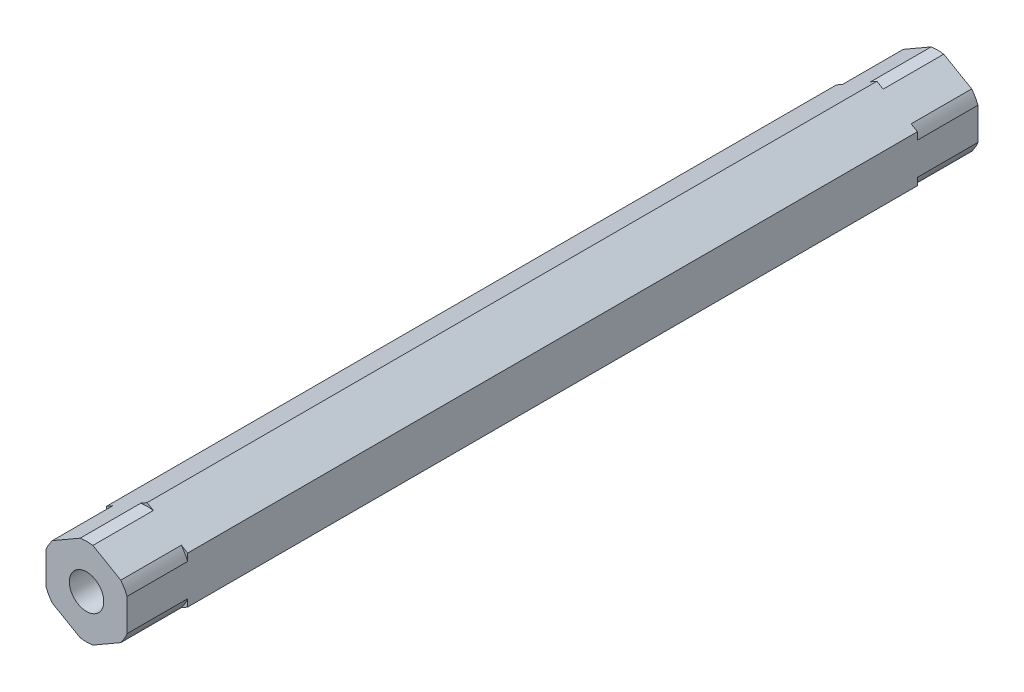
ISO-10303-21;
HEADER;
FILE_DESCRIPTION(('STEP AP214'),'2;1');
FILE_NAME('part.step','',(''),(''),'','','');
FILE_SCHEMA(('AUTOMOTIVE_DESIGN { 1 0 10303 214 1 1 1 1 }'));
ENDSEC;
DATA;
#1=APPLICATION_CONTEXT('core data for automotive mechanical design processes');
#2=APPLICATION_PROTOCOL_DEFINITION('international standard','automotive_design',2000,#1);
#3=PRODUCT_CONTEXT('',#1,'mechanical');
#4=PRODUCT('Part','Part','',(#3));
#5=PRODUCT_RELATED_PRODUCT_CATEGORY('part','',(#4));
#6=PRODUCT_DEFINITION_FORMATION('','',#4);
#7=PRODUCT_DEFINITION_CONTEXT('part definition',#1,'design');
#8=PRODUCT_DEFINITION('design','',#6,#7);
#9=PRODUCT_DEFINITION_SHAPE('','',#8);
#10=(LENGTH_UNIT() NAMED_UNIT(*) SI_UNIT(.MILLI.,.METRE.));
#11=(NAMED_UNIT(*) PLANE_ANGLE_UNIT() SI_UNIT($,.RADIAN.));
#12=(NAMED_UNIT(*) SI_UNIT($,.STERADIAN.) SOLID_ANGLE_UNIT());
#13=UNCERTAINTY_MEASURE_WITH_UNIT(LENGTH_MEASURE(1.E-05),#10,'distance_accuracy_value','');
#14=(GEOMETRIC_REPRESENTATION_CONTEXT(3) GLOBAL_UNCERTAINTY_ASSIGNED_CONTEXT((#13)) GLOBAL_UNIT_ASSIGNED_CONTEXT((#10,
#11,#12)) REPRESENTATION_CONTEXT('',''));
#15=CARTESIAN_POINT('',(0.,0.,0.));
#16=DIRECTION('',(0.,0.,1.));
#17=DIRECTION('',(1.,0.,0.));
#18=AXIS2_PLACEMENT_3D('',#15,#16,#17);
#19=CARTESIAN_POINT('',(2.38125,-4.12444598552339,49.9745));
#20=DIRECTION('',(-0.500000000000001,0.866025403784438,0.));
#21=DIRECTION('',(-0.866025403784438,-0.500000000000001,0.));
#22=AXIS2_PLACEMENT_3D('',#19,#20,#21);
#23=PLANE('',#22);
#24=DIRECTION('',(0.866025403784438,0.500000000000001,0.));
#25=VECTOR('',#24,1.);
#26=CARTESIAN_POINT('',(2.38125,-4.12444598552339,42.8625));
#27=LINE('',#26,#25);
#28=CARTESIAN_POINT('',(0.,-5.49926131403119,42.8625));
#29=VERTEX_POINT('',#28);
#30=CARTESIAN_POINT('',(0.741687844270618,-5.07104763748687,42.8625));
#31=VERTEX_POINT('',#30);
#32=EDGE_CURVE('E284',#29,#31,#27,.T.);
#33=ORIENTED_EDGE('',*,*,#32,.F.);
#34=DIRECTION('',(0.,0.,-1.));
#35=VECTOR('',#34,1.);
#36=CARTESIAN_POINT('',(0.,-5.49926131403119,49.9745));
#37=LINE('',#36,#35);
#38=CARTESIAN_POINT('',(0.,-5.49926131403119,-42.8625));
#39=VERTEX_POINT('',#38);
#40=EDGE_CURVE('E383',#29,#39,#37,.T.);
#41=ORIENTED_EDGE('',*,*,#40,.T.);
#42=DIRECTION('',(-0.866025403784438,-0.500000000000001,0.));
#43=VECTOR('',#42,1.);
#44=CARTESIAN_POINT('',(2.38125,-4.12444598552339,-42.8625));
#45=LINE('',#44,#43);
#46=CARTESIAN_POINT('',(0.741687844270618,-5.07104763748687,-42.8625));
#47=VERTEX_POINT('',#46);
#48=EDGE_CURVE('E329',#47,#39,#45,.T.);
#49=ORIENTED_EDGE('',*,*,#48,.F.);
#50=DIRECTION('',(0.,0.,-1.));
#51=VECTOR('',#50,1.);
#52=CARTESIAN_POINT('',(0.741687844270618,-5.07104763748687,-42.8625));
#53=LINE('',#52,#51);
#54=CARTESIAN_POINT('',(0.741687844270614,-5.07104763748687,-49.9745));
#55=VERTEX_POINT('',#54);
#56=EDGE_CURVE('E323',#55,#47,#53,.F.);
#57=ORIENTED_EDGE('',*,*,#56,.F.);
#58=DIRECTION('',(0.866025403784438,0.500000000000001,0.));
#59=VECTOR('',#58,1.);
#60=CARTESIAN_POINT('',(2.38125,-4.12444598552339,-49.9745));
#61=LINE('',#60,#59);
#62=CARTESIAN_POINT('',(4.02081215572939,-3.1778443335599,-49.9745));
#63=VERTEX_POINT('',#62);
#64=EDGE_CURVE('E356',#55,#63,#61,.T.);
#65=ORIENTED_EDGE('',*,*,#64,.T.);
#66=DIRECTION('',(0.,0.,-1.));
#67=VECTOR('',#66,1.);
#68=CARTESIAN_POINT('',(4.02081215572939,-3.1778443335599,-42.8625));
#69=LINE('',#68,#67);
#70=CARTESIAN_POINT('',(4.02081215572939,-3.1778443335599,-42.8625));
#71=VERTEX_POINT('',#70);
#72=EDGE_CURVE('E325',#71,#63,#69,.T.);
#73=ORIENTED_EDGE('',*,*,#72,.F.);
#74=CARTESIAN_POINT('',(4.7625,-2.74963065701559,-42.8625));
#75=VERTEX_POINT('',#74);
#76=EDGE_CURVE('E333',#75,#71,#45,.T.);
#77=ORIENTED_EDGE('',*,*,#76,.F.);
#78=DIRECTION('',(0.,0.,-1.));
#79=VECTOR('',#78,1.);
#80=CARTESIAN_POINT('',(4.7625,-2.74963065701559,49.9745));
#81=LINE('',#80,#79);
#82=CARTESIAN_POINT('',(4.7625,-2.74963065701559,42.8625));
#83=VERTEX_POINT('',#82);
#84=EDGE_CURVE('E420',#83,#75,#81,.T.);
#85=ORIENTED_EDGE('',*,*,#84,.F.);
#86=CARTESIAN_POINT('',(4.02081215572939,-3.1778443335599,42.8625));
#87=VERTEX_POINT('',#86);
#88=EDGE_CURVE('E285',#87,#83,#27,.T.);
#89=ORIENTED_EDGE('',*,*,#88,.F.);
#90=DIRECTION('',(0.,0.,1.));
#91=VECTOR('',#90,1.);
#92=CARTESIAN_POINT('',(4.02081215572939,-3.1778443335599,42.8625));
#93=LINE('',#92,#91);
#94=CARTESIAN_POINT('',(4.02081215572939,-3.1778443335599,49.9745));
#95=VERTEX_POINT('',#94);
#96=EDGE_CURVE('E278',#87,#95,#93,.T.);
#97=ORIENTED_EDGE('',*,*,#96,.T.);
#98=DIRECTION('',(0.866025403784438,0.500000000000001,0.));
#99=VECTOR('',#98,1.);
#100=CARTESIAN_POINT('',(2.38125,-4.12444598552339,49.9745));
#101=LINE('',#100,#99);
#102=CARTESIAN_POINT('',(0.741687844270614,-5.07104763748687,49.9745));
#103=VERTEX_POINT('',#102);
#104=EDGE_CURVE('E360',#103,#95,#101,.T.);
#105=ORIENTED_EDGE('',*,*,#104,.F.);
#106=DIRECTION('',(0.,0.,1.));
#107=VECTOR('',#106,1.);
#108=CARTESIAN_POINT('',(0.741687844270618,-5.07104763748687,42.8625));
#109=LINE('',#108,#107);
#110=EDGE_CURVE('E281',#103,#31,#109,.F.);
#111=ORIENTED_EDGE('',*,*,#110,.T.);
#112=EDGE_LOOP('',(#33,#41,#49,#57,#65,#73,#77,#85,#89,#97,#105,#111));
#113=FACE_BOUND('',#112,.T.);
#114=ADVANCED_FACE('F39',(#113),#23,.F.);
#115=CARTESIAN_POINT('',(4.7625,0.,49.9745));
#116=DIRECTION('',(-1.,0.,0.));
#117=DIRECTION('',(0.,-1.,0.));
#118=AXIS2_PLACEMENT_3D('',#115,#116,#117);
#119=PLANE('',#118);
#120=DIRECTION('',(0.,1.,0.));
#121=VECTOR('',#120,1.);
#122=CARTESIAN_POINT('',(4.7625,0.,42.8625));
#123=LINE('',#122,#121);
#124=CARTESIAN_POINT('',(4.7625,-1.89320330392697,42.8625));
#125=VERTEX_POINT('',#124);
#126=EDGE_CURVE('E294',#83,#125,#123,.T.);
#127=ORIENTED_EDGE('',*,*,#126,.F.);
#128=ORIENTED_EDGE('',*,*,#84,.T.);
#129=DIRECTION('',(0.,-1.,0.));
#130=VECTOR('',#129,1.);
#131=CARTESIAN_POINT('',(4.7625,0.,-42.8625));
#132=LINE('',#131,#130);
#133=CARTESIAN_POINT('',(4.7625,-1.89320330392697,-42.8625));
#134=VERTEX_POINT('',#133);
#135=EDGE_CURVE('E342',#134,#75,#132,.T.);
#136=ORIENTED_EDGE('',*,*,#135,.F.);
#137=DIRECTION('',(0.,0.,-1.));
#138=VECTOR('',#137,1.);
#139=CARTESIAN_POINT('',(4.7625,-1.89320330392697,-42.8625));
#140=LINE('',#139,#138);
#141=CARTESIAN_POINT('',(4.7625,-1.89320330392697,-49.9745));
#142=VERTEX_POINT('',#141);
#143=EDGE_CURVE('E319',#142,#134,#140,.F.);
#144=ORIENTED_EDGE('',*,*,#143,.F.);
#145=DIRECTION('',(0.,1.,0.));
#146=VECTOR('',#145,1.);
#147=CARTESIAN_POINT('',(4.7625,0.,-49.9745));
#148=LINE('',#147,#146);
#149=CARTESIAN_POINT('',(4.7625,1.89320330392698,-49.9745));
#150=VERTEX_POINT('',#149);
#151=EDGE_CURVE('E387',#142,#150,#148,.T.);
#152=ORIENTED_EDGE('',*,*,#151,.T.);
#153=DIRECTION('',(0.,0.,-1.));
#154=VECTOR('',#153,1.);
#155=CARTESIAN_POINT('',(4.7625,1.89320330392698,-42.8625));
#156=LINE('',#155,#154);
#157=CARTESIAN_POINT('',(4.7625,1.89320330392698,-42.8625));
#158=VERTEX_POINT('',#157);
#159=EDGE_CURVE('E321',#158,#150,#156,.T.);
#160=ORIENTED_EDGE('',*,*,#159,.F.);
#161=CARTESIAN_POINT('',(4.7625,2.7496306570156,-42.8625));
#162=VERTEX_POINT('',#161);
#163=EDGE_CURVE('E340',#162,#158,#132,.T.);
#164=ORIENTED_EDGE('',*,*,#163,.F.);
#165=DIRECTION('',(0.,0.,-1.));
#166=VECTOR('',#165,1.);
#167=CARTESIAN_POINT('',(4.7625,2.7496306570156,49.9745));
#168=LINE('',#167,#166);
#169=CARTESIAN_POINT('',(4.7625,2.7496306570156,42.8625));
#170=VERTEX_POINT('',#169);
#171=EDGE_CURVE('E417',#170,#162,#168,.T.);
#172=ORIENTED_EDGE('',*,*,#171,.F.);
#173=CARTESIAN_POINT('',(4.7625,1.89320330392698,42.8625));
#174=VERTEX_POINT('',#173);
#175=EDGE_CURVE('E292',#174,#170,#123,.T.);
#176=ORIENTED_EDGE('',*,*,#175,.F.);
#177=DIRECTION('',(0.,0.,1.));
#178=VECTOR('',#177,1.);
#179=CARTESIAN_POINT('',(4.7625,1.89320330392698,42.8625));
#180=LINE('',#179,#178);
#181=CARTESIAN_POINT('',(4.7625,1.89320330392698,49.9745));
#182=VERTEX_POINT('',#181);
#183=EDGE_CURVE('E272',#174,#182,#180,.T.);
#184=ORIENTED_EDGE('',*,*,#183,.T.);
#185=DIRECTION('',(0.,1.,0.));
#186=VECTOR('',#185,1.);
#187=CARTESIAN_POINT('',(4.7625,0.,49.9745));
#188=LINE('',#187,#186);
#189=CARTESIAN_POINT('',(4.7625,-1.89320330392697,49.9745));
#190=VERTEX_POINT('',#189);
#191=EDGE_CURVE('E364',#190,#182,#188,.T.);
#192=ORIENTED_EDGE('',*,*,#191,.F.);
#193=DIRECTION('',(0.,0.,1.));
#194=VECTOR('',#193,1.);
#195=CARTESIAN_POINT('',(4.7625,-1.89320330392697,42.8625));
#196=LINE('',#195,#194);
#197=EDGE_CURVE('E275',#190,#125,#196,.F.);
#198=ORIENTED_EDGE('',*,*,#197,.T.);
#199=EDGE_LOOP('',(#127,#128,#136,#144,#152,#160,#164,#172,#176,#184,#192,#198));
#200=FACE_BOUND('',#199,.T.);
#201=ADVANCED_FACE('F523',(#200),#119,.F.);
#202=CARTESIAN_POINT('',(2.38125,4.12444598552339,49.9745));
#203=DIRECTION('',(-0.5,-0.866025403784439,0.));
#204=DIRECTION('',(0.866025403784439,-0.5,0.));
#205=AXIS2_PLACEMENT_3D('',#202,#203,#204);
#206=PLANE('',#205);
#207=DIRECTION('',(-0.866025403784439,0.5,0.));
#208=VECTOR('',#207,1.);
#209=CARTESIAN_POINT('',(2.38125,4.12444598552339,42.8625));
#210=LINE('',#209,#208);
#211=CARTESIAN_POINT('',(4.02081215572938,3.17784433355991,42.8625));
#212=VERTEX_POINT('',#211);
#213=EDGE_CURVE('E291',#170,#212,#210,.T.);
#214=ORIENTED_EDGE('',*,*,#213,.F.);
#215=ORIENTED_EDGE('',*,*,#171,.T.);
#216=DIRECTION('',(0.866025403784439,-0.5,0.));
#217=VECTOR('',#216,1.);
#218=CARTESIAN_POINT('',(2.38125,4.12444598552339,-42.8625));
#219=LINE('',#218,#217);
#220=CARTESIAN_POINT('',(4.02081215572938,3.17784433355991,-42.8625));
#221=VERTEX_POINT('',#220);
#222=EDGE_CURVE('E339',#221,#162,#219,.T.);
#223=ORIENTED_EDGE('',*,*,#222,.F.);
#224=DIRECTION('',(0.,0.,-1.));
#225=VECTOR('',#224,1.);
#226=CARTESIAN_POINT('',(4.02081215572938,3.17784433355991,-42.8625));
#227=LINE('',#226,#225);
#228=CARTESIAN_POINT('',(4.02081215572939,3.17784433355991,-49.9745));
#229=VERTEX_POINT('',#228);
#230=EDGE_CURVE('E315',#229,#221,#227,.F.);
#231=ORIENTED_EDGE('',*,*,#230,.F.);
#232=DIRECTION('',(-0.866025403784439,0.5,0.));
#233=VECTOR('',#232,1.);
#234=CARTESIAN_POINT('',(2.38125,4.12444598552339,-49.9745));
#235=LINE('',#234,#233);
#236=CARTESIAN_POINT('',(0.741687844270609,5.07104763748687,-49.9745));
#237=VERTEX_POINT('',#236);
#238=EDGE_CURVE('E391',#229,#237,#235,.T.);
#239=ORIENTED_EDGE('',*,*,#238,.T.);
#240=DIRECTION('',(0.,0.,-1.));
#241=VECTOR('',#240,1.);
#242=CARTESIAN_POINT('',(0.741687844270613,5.07104763748687,-42.8625));
#243=LINE('',#242,#241);
#244=CARTESIAN_POINT('',(0.741687844270613,5.07104763748687,-42.8625));
#245=VERTEX_POINT('',#244);
#246=EDGE_CURVE('E317',#245,#237,#243,.T.);
#247=ORIENTED_EDGE('',*,*,#246,.F.);
#248=CARTESIAN_POINT('',(0.,5.49926131403118,-42.8625));
#249=VERTEX_POINT('',#248);
#250=EDGE_CURVE('E337',#249,#245,#219,.T.);
#251=ORIENTED_EDGE('',*,*,#250,.F.);
#252=DIRECTION('',(0.,0.,-1.));
#253=VECTOR('',#252,1.);
#254=CARTESIAN_POINT('',(0.,5.49926131403119,49.9745));
#255=LINE('',#254,#253);
#256=CARTESIAN_POINT('',(0.,5.49926131403118,42.8625));
#257=VERTEX_POINT('',#256);
#258=EDGE_CURVE('E414',#257,#249,#255,.T.);
#259=ORIENTED_EDGE('',*,*,#258,.F.);
#260=CARTESIAN_POINT('',(0.741687844270613,5.07104763748687,42.8625));
#261=VERTEX_POINT('',#260);
#262=EDGE_CURVE('E289',#261,#257,#210,.T.);
#263=ORIENTED_EDGE('',*,*,#262,.F.);
#264=DIRECTION('',(0.,0.,1.));
#265=VECTOR('',#264,1.);
#266=CARTESIAN_POINT('',(0.741687844270613,5.07104763748687,42.8625));
#267=LINE('',#266,#265);
#268=CARTESIAN_POINT('',(0.741687844270609,5.07104763748687,49.9745));
#269=VERTEX_POINT('',#268);
#270=EDGE_CURVE('E266',#261,#269,#267,.T.);
#271=ORIENTED_EDGE('',*,*,#270,.T.);
#272=DIRECTION('',(-0.866025403784439,0.5,0.));
#273=VECTOR('',#272,1.);
#274=CARTESIAN_POINT('',(2.38125,4.12444598552339,49.9745));
#275=LINE('',#274,#273);
#276=CARTESIAN_POINT('',(4.02081215572939,3.17784433355991,49.9745));
#277=VERTEX_POINT('',#276);
#278=EDGE_CURVE('E369',#277,#269,#275,.T.);
#279=ORIENTED_EDGE('',*,*,#278,.F.);
#280=DIRECTION('',(0.,0.,1.));
#281=VECTOR('',#280,1.);
#282=CARTESIAN_POINT('',(4.02081215572938,3.17784433355991,42.8625));
#283=LINE('',#282,#281);
#284=EDGE_CURVE('E269',#277,#212,#283,.F.);
#285=ORIENTED_EDGE('',*,*,#284,.T.);
#286=EDGE_LOOP('',(#214,#215,#223,#231,#239,#247,#251,#259,#263,#271,#279,#285));
#287=FACE_BOUND('',#286,.T.);
#288=ADVANCED_FACE('F550',(#287),#206,.F.);
#289=CARTESIAN_POINT('',(-2.38125,4.12444598552339,49.9745));
#290=DIRECTION('',(0.5,-0.866025403784439,0.));
#291=DIRECTION('',(0.866025403784439,0.5,0.));
#292=AXIS2_PLACEMENT_3D('',#289,#290,#291);
#293=PLANE('',#292);
#294=DIRECTION('',(-0.866025403784439,-0.5,0.));
#295=VECTOR('',#294,1.);
#296=CARTESIAN_POINT('',(-2.38125,4.12444598552339,42.8625));
#297=LINE('',#296,#295);
#298=CARTESIAN_POINT('',(-0.741687844270613,5.07104763748687,42.8625));
#299=VERTEX_POINT('',#298);
#300=EDGE_CURVE('E288',#257,#299,#297,.T.);
#301=ORIENTED_EDGE('',*,*,#300,.F.);
#302=ORIENTED_EDGE('',*,*,#258,.T.);
#303=DIRECTION('',(0.866025403784439,0.5,0.));
#304=VECTOR('',#303,1.);
#305=CARTESIAN_POINT('',(-2.38125,4.12444598552339,-42.8625));
#306=LINE('',#305,#304);
#307=CARTESIAN_POINT('',(-0.741687844270613,5.07104763748687,-42.8625));
#308=VERTEX_POINT('',#307);
#309=EDGE_CURVE('E336',#308,#249,#306,.T.);
#310=ORIENTED_EDGE('',*,*,#309,.F.);
#311=DIRECTION('',(0.,0.,-1.));
#312=VECTOR('',#311,1.);
#313=CARTESIAN_POINT('',(-0.741687844270613,5.07104763748687,-42.8625));
#314=LINE('',#313,#312);
#315=CARTESIAN_POINT('',(-0.741687844270611,5.07104763748687,-49.9745));
#316=VERTEX_POINT('',#315);
#317=EDGE_CURVE('E311',#316,#308,#314,.F.);
#318=ORIENTED_EDGE('',*,*,#317,.F.);
#319=DIRECTION('',(-0.866025403784438,-0.5,0.));
#320=VECTOR('',#319,1.);
#321=CARTESIAN_POINT('',(-2.38125,4.12444598552339,-49.9745));
#322=LINE('',#321,#320);
#323=CARTESIAN_POINT('',(-4.02081215572939,3.1778443335599,-49.9745));
#324=VERTEX_POINT('',#323);
#325=EDGE_CURVE('E395',#316,#324,#322,.T.);
#326=ORIENTED_EDGE('',*,*,#325,.T.);
#327=DIRECTION('',(0.,0.,-1.));
#328=VECTOR('',#327,1.);
#329=CARTESIAN_POINT('',(-4.02081215572939,3.1778443335599,-42.8625));
#330=LINE('',#329,#328);
#331=CARTESIAN_POINT('',(-4.02081215572939,3.1778443335599,-42.8625));
#332=VERTEX_POINT('',#331);
#333=EDGE_CURVE('E313',#332,#324,#330,.T.);
#334=ORIENTED_EDGE('',*,*,#333,.F.);
#335=CARTESIAN_POINT('',(-4.7625,2.74963065701559,-42.8625));
#336=VERTEX_POINT('',#335);
#337=EDGE_CURVE('E334',#336,#332,#306,.T.);
#338=ORIENTED_EDGE('',*,*,#337,.F.);
#339=DIRECTION('',(0.,0.,-1.));
#340=VECTOR('',#339,1.);
#341=CARTESIAN_POINT('',(-4.7625,2.74963065701559,49.9745));
#342=LINE('',#341,#340);
#343=CARTESIAN_POINT('',(-4.7625,2.74963065701559,42.8625));
#344=VERTEX_POINT('',#343);
#345=EDGE_CURVE('E411',#344,#336,#342,.T.);
#346=ORIENTED_EDGE('',*,*,#345,.F.);
#347=CARTESIAN_POINT('',(-4.02081215572939,3.1778443335599,42.8625));
#348=VERTEX_POINT('',#347);
#349=EDGE_CURVE('E240',#348,#344,#297,.T.);
#350=ORIENTED_EDGE('',*,*,#349,.F.);
#351=DIRECTION('',(0.,0.,1.));
#352=VECTOR('',#351,1.);
#353=CARTESIAN_POINT('',(-4.02081215572939,3.1778443335599,42.8625));
#354=LINE('',#353,#352);
#355=CARTESIAN_POINT('',(-4.02081215572939,3.1778443335599,49.9745));
#356=VERTEX_POINT('',#355);
#357=EDGE_CURVE('E247',#348,#356,#354,.T.);
#358=ORIENTED_EDGE('',*,*,#357,.T.);
#359=DIRECTION('',(-0.866025403784438,-0.5,0.));
#360=VECTOR('',#359,1.);
#361=CARTESIAN_POINT('',(-2.38125,4.12444598552339,49.9745));
#362=LINE('',#361,#360);
#363=CARTESIAN_POINT('',(-0.741687844270611,5.07104763748687,49.9745));
#364=VERTEX_POINT('',#363);
#365=EDGE_CURVE('E373',#364,#356,#362,.T.);
#366=ORIENTED_EDGE('',*,*,#365,.F.);
#367=DIRECTION('',(0.,0.,1.));
#368=VECTOR('',#367,1.);
#369=CARTESIAN_POINT('',(-0.741687844270613,5.07104763748687,42.8625));
#370=LINE('',#369,#368);
#371=EDGE_CURVE('E259',#364,#299,#370,.F.);
#372=ORIENTED_EDGE('',*,*,#371,.T.);
#373=EDGE_LOOP('',(#301,#302,#310,#318,#326,#334,#338,#346,#350,#358,#366,#372));
#374=FACE_BOUND('',#373,.T.);
#375=ADVANCED_FACE('F554',(#374),#293,.F.);
#376=CARTESIAN_POINT('',(-4.7625,0.,49.9745));
#377=DIRECTION('',(1.,0.,0.));
#378=DIRECTION('',(0.,1.,0.));
#379=AXIS2_PLACEMENT_3D('',#376,#377,#378);
#380=PLANE('',#379);
#381=DIRECTION('',(0.,-1.,0.));
#382=VECTOR('',#381,1.);
#383=CARTESIAN_POINT('',(-4.7625,0.,42.8625));
#384=LINE('',#383,#382);
#385=CARTESIAN_POINT('',(-4.7625,1.89320330392697,42.8625));
#386=VERTEX_POINT('',#385);
#387=EDGE_CURVE('E236',#344,#386,#384,.T.);
#388=ORIENTED_EDGE('',*,*,#387,.F.);
#389=ORIENTED_EDGE('',*,*,#345,.T.);
#390=DIRECTION('',(0.,1.,0.));
#391=VECTOR('',#390,1.);
#392=CARTESIAN_POINT('',(-4.7625,0.,-42.8625));
#393=LINE('',#392,#391);
#394=CARTESIAN_POINT('',(-4.7625,1.89320330392697,-42.8625));
#395=VERTEX_POINT('',#394);
#396=EDGE_CURVE('E330',#395,#336,#393,.T.);
#397=ORIENTED_EDGE('',*,*,#396,.F.);
#398=DIRECTION('',(0.,0.,-1.));
#399=VECTOR('',#398,1.);
#400=CARTESIAN_POINT('',(-4.7625,1.89320330392697,-42.8625));
#401=LINE('',#400,#399);
#402=CARTESIAN_POINT('',(-4.7625,1.89320330392697,-49.9745));
#403=VERTEX_POINT('',#402);
#404=EDGE_CURVE('E307',#403,#395,#401,.F.);
#405=ORIENTED_EDGE('',*,*,#404,.F.);
#406=DIRECTION('',(0.,-1.,0.));
#407=VECTOR('',#406,1.);
#408=CARTESIAN_POINT('',(-4.7625,0.,-49.9745));
#409=LINE('',#408,#407);
#410=CARTESIAN_POINT('',(-4.7625,-1.89320330392697,-49.9745));
#411=VERTEX_POINT('',#410);
#412=EDGE_CURVE('E399',#403,#411,#409,.T.);
#413=ORIENTED_EDGE('',*,*,#412,.T.);
#414=DIRECTION('',(0.,0.,-1.));
#415=VECTOR('',#414,1.);
#416=CARTESIAN_POINT('',(-4.7625,-1.89320330392697,-42.8625));
#417=LINE('',#416,#415);
#418=CARTESIAN_POINT('',(-4.7625,-1.89320330392697,-42.8625));
#419=VERTEX_POINT('',#418);
#420=EDGE_CURVE('E309',#419,#411,#417,.T.);
#421=ORIENTED_EDGE('',*,*,#420,.F.);
#422=CARTESIAN_POINT('',(-4.7625,-2.7496306570156,-42.8625));
#423=VERTEX_POINT('',#422);
#424=EDGE_CURVE('E327',#423,#419,#393,.T.);
#425=ORIENTED_EDGE('',*,*,#424,.F.);
#426=DIRECTION('',(0.,0.,-1.));
#427=VECTOR('',#426,1.);
#428=CARTESIAN_POINT('',(-4.7625,-2.7496306570156,49.9745));
#429=LINE('',#428,#427);
#430=CARTESIAN_POINT('',(-4.7625,-2.7496306570156,42.8625));
#431=VERTEX_POINT('',#430);
#432=EDGE_CURVE('E408',#431,#423,#429,.T.);
#433=ORIENTED_EDGE('',*,*,#432,.F.);
#434=CARTESIAN_POINT('',(-4.7625,-1.89320330392697,42.8625));
#435=VERTEX_POINT('',#434);
#436=EDGE_CURVE('E243',#435,#431,#384,.T.);
#437=ORIENTED_EDGE('',*,*,#436,.F.);
#438=DIRECTION('',(0.,0.,1.));
#439=VECTOR('',#438,1.);
#440=CARTESIAN_POINT('',(-4.7625,-1.89320330392697,42.8625));
#441=LINE('',#440,#439);
#442=CARTESIAN_POINT('',(-4.7625,-1.89320330392697,49.9745));
#443=VERTEX_POINT('',#442);
#444=EDGE_CURVE('E257',#435,#443,#441,.T.);
#445=ORIENTED_EDGE('',*,*,#444,.T.);
#446=DIRECTION('',(0.,-1.,0.));
#447=VECTOR('',#446,1.);
#448=CARTESIAN_POINT('',(-4.7625,0.,49.9745));
#449=LINE('',#448,#447);
#450=CARTESIAN_POINT('',(-4.7625,1.89320330392697,49.9745));
#451=VERTEX_POINT('',#450);
#452=EDGE_CURVE('E256',#451,#443,#449,.T.);
#453=ORIENTED_EDGE('',*,*,#452,.F.);
#454=DIRECTION('',(0.,0.,1.));
#455=VECTOR('',#454,1.);
#456=CARTESIAN_POINT('',(-4.7625,1.89320330392697,42.8625));
#457=LINE('',#456,#455);
#458=EDGE_CURVE('E61',#451,#386,#457,.F.);
#459=ORIENTED_EDGE('',*,*,#458,.T.);
#460=EDGE_LOOP('',(#388,#389,#397,#405,#413,#421,#425,#433,#437,#445,#453,#459));
#461=FACE_BOUND('',#460,.T.);
#462=ADVANCED_FACE('F253',(#461),#380,.F.);
#463=CARTESIAN_POINT('',(-2.38125,-4.12444598552339,49.9745));
#464=DIRECTION('',(0.499999999999999,0.866025403784439,0.));
#465=DIRECTION('',(-0.866025403784439,0.5,0.));
#466=AXIS2_PLACEMENT_3D('',#463,#464,#465);
#467=PLANE('',#466);
#468=DIRECTION('',(0.866025403784439,-0.5,0.));
#469=VECTOR('',#468,1.);
#470=CARTESIAN_POINT('',(-2.38125,-4.12444598552339,42.8625));
#471=LINE('',#470,#469);
#472=CARTESIAN_POINT('',(-4.02081215572939,-3.17784433355991,42.8625));
#473=VERTEX_POINT('',#472);
#474=EDGE_CURVE('E11',#431,#473,#471,.T.);
#475=ORIENTED_EDGE('',*,*,#474,.F.);
#476=ORIENTED_EDGE('',*,*,#432,.T.);
#477=DIRECTION('',(-0.866025403784439,0.5,0.));
#478=VECTOR('',#477,1.);
#479=CARTESIAN_POINT('',(-2.38125,-4.12444598552339,-42.8625));
#480=LINE('',#479,#478);
#481=CARTESIAN_POINT('',(-4.02081215572939,-3.17784433355991,-42.8625));
#482=VERTEX_POINT('',#481);
#483=EDGE_CURVE('E427',#482,#423,#480,.T.);
#484=ORIENTED_EDGE('',*,*,#483,.F.);
#485=DIRECTION('',(0.,0.,-1.));
#486=VECTOR('',#485,1.);
#487=CARTESIAN_POINT('',(-4.02081215572938,-3.17784433355991,-42.8625));
#488=LINE('',#487,#486);
#489=CARTESIAN_POINT('',(-4.02081215572938,-3.17784433355991,-49.9745));
#490=VERTEX_POINT('',#489);
#491=EDGE_CURVE('E298',#490,#482,#488,.F.);
#492=ORIENTED_EDGE('',*,*,#491,.F.);
#493=DIRECTION('',(0.866025403784439,-0.5,0.));
#494=VECTOR('',#493,1.);
#495=CARTESIAN_POINT('',(-2.38125,-4.12444598552339,-49.9745));
#496=LINE('',#495,#494);
#497=CARTESIAN_POINT('',(-0.741687844270615,-5.07104763748687,-49.9745));
#498=VERTEX_POINT('',#497);
#499=EDGE_CURVE('E365',#490,#498,#496,.T.);
#500=ORIENTED_EDGE('',*,*,#499,.T.);
#501=DIRECTION('',(0.,0.,-1.));
#502=VECTOR('',#501,1.);
#503=CARTESIAN_POINT('',(-0.741687844270611,-5.07104763748687,-42.8625));
#504=LINE('',#503,#502);
#505=CARTESIAN_POINT('',(-0.741687844270611,-5.07104763748687,-42.8625));
#506=VERTEX_POINT('',#505);
#507=EDGE_CURVE('E305',#506,#498,#504,.T.);
#508=ORIENTED_EDGE('',*,*,#507,.F.);
#509=EDGE_CURVE('E429',#39,#506,#480,.T.);
#510=ORIENTED_EDGE('',*,*,#509,.F.);
#511=ORIENTED_EDGE('',*,*,#40,.F.);
#512=CARTESIAN_POINT('',(-0.741687844270611,-5.07104763748687,42.8625));
#513=VERTEX_POINT('',#512);
#514=EDGE_CURVE('E42',#513,#29,#471,.T.);
#515=ORIENTED_EDGE('',*,*,#514,.F.);
#516=DIRECTION('',(0.,0.,1.));
#517=VECTOR('',#516,1.);
#518=CARTESIAN_POINT('',(-0.741687844270611,-5.07104763748687,42.8625));
#519=LINE('',#518,#517);
#520=CARTESIAN_POINT('',(-0.741687844270615,-5.07104763748687,49.9745));
#521=VERTEX_POINT('',#520);
#522=EDGE_CURVE('E248',#513,#521,#519,.T.);
#523=ORIENTED_EDGE('',*,*,#522,.T.);
#524=DIRECTION('',(0.866025403784439,-0.5,0.));
#525=VECTOR('',#524,1.);
#526=CARTESIAN_POINT('',(-2.38125,-4.12444598552339,49.9745));
#527=LINE('',#526,#525);
#528=CARTESIAN_POINT('',(-4.02081215572938,-3.17784433355991,49.9745));
#529=VERTEX_POINT('',#528);
#530=EDGE_CURVE('E379',#529,#521,#527,.T.);
#531=ORIENTED_EDGE('',*,*,#530,.F.);
#532=DIRECTION('',(0.,0.,1.));
#533=VECTOR('',#532,1.);
#534=CARTESIAN_POINT('',(-4.02081215572938,-3.17784433355991,42.8625));
#535=LINE('',#534,#533);
#536=EDGE_CURVE('E53',#529,#473,#535,.F.);
#537=ORIENTED_EDGE('',*,*,#536,.T.);
#538=EDGE_LOOP('',(#475,#476,#484,#492,#500,#508,#510,#511,#515,#523,#531,#537));
#539=FACE_BOUND('',#538,.T.);
#540=ADVANCED_FACE('F457',(#539),#467,.F.);
#541=CARTESIAN_POINT('',(0.,0.,49.9745));
#542=DIRECTION('',(0.,0.,1.));
#543=DIRECTION('',(1.,0.,0.));
#544=AXIS2_PLACEMENT_3D('',#541,#542,#543);
#545=PLANE('',#544);
#546=CARTESIAN_POINT('',(0.,0.,49.9745));
#547=DIRECTION('',(0.,0.,-1.));
#548=DIRECTION('',(-1.,0.,0.));
#549=AXIS2_PLACEMENT_3D('',#546,#547,#548);
#550=CIRCLE('',#549,2.0193);
#551=CARTESIAN_POINT('',(2.0193,0.,49.9745));
#552=VERTEX_POINT('',#551);
#553=EDGE_CURVE('E348',#552,#552,#550,.T.);
#554=ORIENTED_EDGE('',*,*,#553,.T.);
#555=EDGE_LOOP('',(#554));
#556=FACE_BOUND('',#555,.T.);
#557=CARTESIAN_POINT('',(0.,0.,49.9745));
#558=DIRECTION('',(0.,0.,1.));
#559=DIRECTION('',(1.,0.,0.));
#560=AXIS2_PLACEMENT_3D('',#557,#558,#559);
#561=CIRCLE('',#560,5.125);
#562=EDGE_CURVE('E432',#190,#95,#561,.F.);
#563=ORIENTED_EDGE('',*,*,#562,.F.);
#564=ORIENTED_EDGE('',*,*,#191,.T.);
#565=EDGE_CURVE('E430',#277,#182,#561,.F.);
#566=ORIENTED_EDGE('',*,*,#565,.F.);
#567=ORIENTED_EDGE('',*,*,#278,.T.);
#568=EDGE_CURVE('E431',#364,#269,#561,.F.);
#569=ORIENTED_EDGE('',*,*,#568,.F.);
#570=ORIENTED_EDGE('',*,*,#365,.T.);
#571=CARTESIAN_POINT('',(0.,0.,49.9745));
#572=DIRECTION('',(0.,0.,-1.));
#573=DIRECTION('',(-1.,0.,0.));
#574=AXIS2_PLACEMENT_3D('',#571,#572,#573);
#575=CIRCLE('',#574,5.125);
#576=EDGE_CURVE('E449',#451,#356,#575,.T.);
#577=ORIENTED_EDGE('',*,*,#576,.F.);
#578=ORIENTED_EDGE('',*,*,#452,.T.);
#579=EDGE_CURVE('E435',#529,#443,#561,.F.);
#580=ORIENTED_EDGE('',*,*,#579,.F.);
#581=ORIENTED_EDGE('',*,*,#530,.T.);
#582=EDGE_CURVE('E436',#103,#521,#561,.F.);
#583=ORIENTED_EDGE('',*,*,#582,.F.);
#584=ORIENTED_EDGE('',*,*,#104,.T.);
#585=EDGE_LOOP('',(#563,#564,#566,#567,#569,#570,#577,#578,#580,#581,#583,#584));
#586=FACE_BOUND('',#585,.T.);
#587=ADVANCED_FACE('F448',(#556,#586),#545,.T.);
#588=CARTESIAN_POINT('',(0.,0.,-49.9745));
#589=DIRECTION('',(0.,0.,1.));
#590=DIRECTION('',(1.,0.,0.));
#591=AXIS2_PLACEMENT_3D('',#588,#589,#590);
#592=PLANE('',#591);
#593=CARTESIAN_POINT('',(0.,0.,-49.9745));
#594=DIRECTION('',(0.,0.,-1.));
#595=DIRECTION('',(-1.,0.,0.));
#596=AXIS2_PLACEMENT_3D('',#593,#594,#595);
#597=CIRCLE('',#596,2.0193);
#598=CARTESIAN_POINT('',(-2.0193,0.,-49.9745));
#599=VERTEX_POINT('',#598);
#600=EDGE_CURVE('E347',#599,#599,#597,.T.);
#601=ORIENTED_EDGE('',*,*,#600,.F.);
#602=EDGE_LOOP('',(#601));
#603=FACE_BOUND('',#602,.T.);
#604=CARTESIAN_POINT('',(0.,0.,-49.9745));
#605=DIRECTION('',(0.,0.,1.));
#606=DIRECTION('',(1.,0.,0.));
#607=AXIS2_PLACEMENT_3D('',#604,#605,#606);
#608=CIRCLE('',#607,5.125);
#609=EDGE_CURVE('E426',#150,#229,#608,.T.);
#610=ORIENTED_EDGE('',*,*,#609,.F.);
#611=ORIENTED_EDGE('',*,*,#151,.F.);
#612=EDGE_CURVE('E423',#63,#142,#608,.T.);
#613=ORIENTED_EDGE('',*,*,#612,.F.);
#614=ORIENTED_EDGE('',*,*,#64,.F.);
#615=EDGE_CURVE('E425',#498,#55,#608,.T.);
#616=ORIENTED_EDGE('',*,*,#615,.F.);
#617=ORIENTED_EDGE('',*,*,#499,.F.);
#618=EDGE_CURVE('E509',#411,#490,#608,.T.);
#619=ORIENTED_EDGE('',*,*,#618,.F.);
#620=ORIENTED_EDGE('',*,*,#412,.F.);
#621=CARTESIAN_POINT('',(0.,0.,-49.9745));
#622=DIRECTION('',(0.,0.,-1.));
#623=DIRECTION('',(-1.,0.,0.));
#624=AXIS2_PLACEMENT_3D('',#621,#622,#623);
#625=CIRCLE('',#624,5.125);
#626=EDGE_CURVE('E301',#403,#324,#625,.T.);
#627=ORIENTED_EDGE('',*,*,#626,.T.);
#628=ORIENTED_EDGE('',*,*,#325,.F.);
#629=EDGE_CURVE('E511',#237,#316,#608,.T.);
#630=ORIENTED_EDGE('',*,*,#629,.F.);
#631=ORIENTED_EDGE('',*,*,#238,.F.);
#632=EDGE_LOOP('',(#610,#611,#613,#614,#616,#617,#619,#620,#627,#628,#630,#631));
#633=FACE_BOUND('',#632,.T.);
#634=ADVANCED_FACE('F506',(#603,#633),#592,.F.);
#635=CARTESIAN_POINT('',(0.,0.,-30.9245));
#636=DIRECTION('',(0.,0.,-1.));
#637=DIRECTION('',(-1.,0.,0.));
#638=AXIS2_PLACEMENT_3D('',#635,#636,#637);
#639=CYLINDRICAL_SURFACE('',#638,2.0193);
#640=CARTESIAN_POINT('',(0.,0.,-30.9245));
#641=DIRECTION('',(0.,0.,-1.));
#642=DIRECTION('',(-1.,0.,0.));
#643=AXIS2_PLACEMENT_3D('',#640,#641,#642);
#644=CIRCLE('',#643,2.0193);
#645=CARTESIAN_POINT('',(-2.0193,0.,-30.9245));
#646=VERTEX_POINT('',#645);
#647=EDGE_CURVE('E352',#646,#646,#644,.T.);
#648=CARTESIAN_POINT('',(-2.0193,0.,-30.9245));
#649=CARTESIAN_POINT('',(-2.0193,0.,-31.1229375));
#650=CARTESIAN_POINT('',(-2.0193,0.,-31.321375));
#651=CARTESIAN_POINT('',(-2.0193,0.,-31.71825));
#652=CARTESIAN_POINT('',(-2.0193,0.,-31.9166875));
#653=CARTESIAN_POINT('',(-2.0193,0.,-32.3135625));
#654=CARTESIAN_POINT('',(-2.0193,0.,-32.512));
#655=CARTESIAN_POINT('',(-2.0193,0.,-32.908875));
#656=CARTESIAN_POINT('',(-2.0193,0.,-33.1073125));
#657=CARTESIAN_POINT('',(-2.0193,0.,-33.5041875));
#658=CARTESIAN_POINT('',(-2.0193,0.,-33.702625));
#659=CARTESIAN_POINT('',(-2.0193,0.,-34.0995));
#660=CARTESIAN_POINT('',(-2.0193,0.,-34.2979375));
#661=CARTESIAN_POINT('',(-2.0193,0.,-34.6948125));
#662=CARTESIAN_POINT('',(-2.0193,0.,-34.89325));
#663=CARTESIAN_POINT('',(-2.0193,0.,-35.290125));
#664=CARTESIAN_POINT('',(-2.0193,0.,-35.4885625));
#665=CARTESIAN_POINT('',(-2.0193,0.,-35.8854375));
#666=CARTESIAN_POINT('',(-2.0193,0.,-36.083875));
#667=CARTESIAN_POINT('',(-2.0193,0.,-36.48075));
#668=CARTESIAN_POINT('',(-2.0193,0.,-36.6791875));
#669=CARTESIAN_POINT('',(-2.0193,0.,-37.0760625));
#670=CARTESIAN_POINT('',(-2.0193,0.,-37.2745));
#671=CARTESIAN_POINT('',(-2.0193,0.,-37.671375));
#672=CARTESIAN_POINT('',(-2.0193,0.,-37.8698125));
#673=CARTESIAN_POINT('',(-2.0193,0.,-38.2666875));
#674=CARTESIAN_POINT('',(-2.0193,0.,-38.465125));
#675=CARTESIAN_POINT('',(-2.0193,0.,-38.862));
#676=CARTESIAN_POINT('',(-2.0193,0.,-39.0604375));
#677=CARTESIAN_POINT('',(-2.0193,0.,-39.4573125));
#678=CARTESIAN_POINT('',(-2.0193,0.,-39.65575));
#679=CARTESIAN_POINT('',(-2.0193,0.,-40.052625));
#680=CARTESIAN_POINT('',(-2.0193,0.,-40.2510625));
#681=CARTESIAN_POINT('',(-2.0193,0.,-40.6479375));
#682=CARTESIAN_POINT('',(-2.0193,0.,-40.846375));
#683=CARTESIAN_POINT('',(-2.0193,0.,-41.24325));
#684=CARTESIAN_POINT('',(-2.0193,0.,-41.4416875));
#685=CARTESIAN_POINT('',(-2.0193,0.,-41.8385625));
#686=CARTESIAN_POINT('',(-2.0193,0.,-42.037));
#687=CARTESIAN_POINT('',(-2.0193,0.,-42.433875));
#688=CARTESIAN_POINT('',(-2.0193,0.,-42.6323125));
#689=CARTESIAN_POINT('',(-2.0193,0.,-43.0291875));
#690=CARTESIAN_POINT('',(-2.0193,0.,-43.227625));
#691=CARTESIAN_POINT('',(-2.0193,0.,-43.6245));
#692=CARTESIAN_POINT('',(-2.0193,0.,-43.8229375));
#693=CARTESIAN_POINT('',(-2.0193,0.,-44.2198125));
#694=CARTESIAN_POINT('',(-2.0193,0.,-44.41825));
#695=CARTESIAN_POINT('',(-2.0193,0.,-44.815125));
#696=CARTESIAN_POINT('',(-2.0193,0.,-45.0135625));
#697=CARTESIAN_POINT('',(-2.0193,0.,-45.4104375));
#698=CARTESIAN_POINT('',(-2.0193,0.,-45.608875));
#699=CARTESIAN_POINT('',(-2.0193,0.,-46.00575));
#700=CARTESIAN_POINT('',(-2.0193,0.,-46.2041875));
#701=CARTESIAN_POINT('',(-2.0193,0.,-46.6010625));
#702=CARTESIAN_POINT('',(-2.0193,0.,-46.7995));
#703=CARTESIAN_POINT('',(-2.0193,0.,-47.196375));
#704=CARTESIAN_POINT('',(-2.0193,0.,-47.3948125));
#705=CARTESIAN_POINT('',(-2.0193,0.,-47.7916875));
#706=CARTESIAN_POINT('',(-2.0193,0.,-47.990125));
#707=CARTESIAN_POINT('',(-2.0193,0.,-48.387));
#708=CARTESIAN_POINT('',(-2.0193,0.,-48.5854375));
#709=CARTESIAN_POINT('',(-2.0193,0.,-48.9823125));
#710=CARTESIAN_POINT('',(-2.0193,0.,-49.18075));
#711=CARTESIAN_POINT('',(-2.0193,0.,-49.577625));
#712=CARTESIAN_POINT('',(-2.0193,0.,-49.7760625));
#713=CARTESIAN_POINT('',(-2.0193,0.,-49.9745));
#714=B_SPLINE_CURVE_WITH_KNOTS('',3,(#648,#649,#650,#651,#652,#653,#654,#655,#656,#657,#658,
#659,#660,#661,#662,#663,#664,#665,#666,#667,#668,#669,#670,#671,#672,#673,#674,#675,#676,#677,
#678,#679,#680,#681,#682,#683,#684,#685,#686,#687,#688,#689,#690,#691,#692,#693,#694,#695,#696,
#697,#698,#699,#700,#701,#702,#703,#704,#705,#706,#707,#708,#709,#710,#711,#712,#713),
.UNSPECIFIED.,.F.,.F.,(4,2,2,2,2,2,2,2,2,2,2,2,2,2,2,2,2,2,2,2,2,2,2,2,2,2,2,2,2,2,2,2,4),(0.,
0.595312499999997,1.190625,1.7859375,2.38125,2.9765625,3.571875,4.1671875,4.7625,5.3578125,
5.953125,6.5484375,7.14375,7.7390625,8.334375,8.9296875,9.525,10.1203125,10.715625,11.3109375,
11.90625,12.5015625,13.096875,13.6921875,14.2875,14.8828125,15.478125,16.0734375,16.66875,
17.2640625,17.859375,18.4546875,19.05),.UNSPECIFIED.);
#715=EDGE_CURVE('BSEAM567',#646,#599,#714,.T.);
#716=ORIENTED_EDGE('',*,*,#647,.F.);
#717=ORIENTED_EDGE('',*,*,#600,.T.);
#718=ORIENTED_EDGE('',*,*,#715,.T.);
#719=ORIENTED_EDGE('',*,*,#715,.F.);
#720=EDGE_LOOP('',(#716,#718,#717,#719));
#721=FACE_BOUND('',#720,.T.);
#722=ADVANCED_FACE('F567',(#721),#639,.F.);
#723=CARTESIAN_POINT('',(0.,0.,-30.9245));
#724=DIRECTION('',(0.,0.,-1.));
#725=DIRECTION('',(-1.,0.,0.));
#726=AXIS2_PLACEMENT_3D('',#723,#724,#725);
#727=PLANE('',#726);
#728=ORIENTED_EDGE('',*,*,#647,.T.);
#729=EDGE_LOOP('',(#728));
#730=FACE_BOUND('',#729,.T.);
#731=ADVANCED_FACE('F574',(#730),#727,.T.);
#732=CARTESIAN_POINT('',(0.,0.,30.9245));
#733=DIRECTION('',(0.,0.,1.));
#734=DIRECTION('',(1.,0.,0.));
#735=AXIS2_PLACEMENT_3D('',#732,#733,#734);
#736=CYLINDRICAL_SURFACE('',#735,2.0193);
#737=CARTESIAN_POINT('',(0.,0.,30.9245));
#738=DIRECTION('',(0.,0.,-1.));
#739=DIRECTION('',(-1.,0.,0.));
#740=AXIS2_PLACEMENT_3D('',#737,#738,#739);
#741=CIRCLE('',#740,2.0193);
#742=CARTESIAN_POINT('',(2.0193,0.,30.9245));
#743=VERTEX_POINT('',#742);
#744=EDGE_CURVE('E343',#743,#743,#741,.T.);
#745=CARTESIAN_POINT('',(2.0193,0.,30.9245));
#746=CARTESIAN_POINT('',(2.0193,0.,31.1229375));
#747=CARTESIAN_POINT('',(2.0193,0.,31.321375));
#748=CARTESIAN_POINT('',(2.0193,0.,31.71825));
#749=CARTESIAN_POINT('',(2.0193,0.,31.9166875));
#750=CARTESIAN_POINT('',(2.0193,0.,32.3135625));
#751=CARTESIAN_POINT('',(2.0193,0.,32.512));
#752=CARTESIAN_POINT('',(2.0193,0.,32.908875));
#753=CARTESIAN_POINT('',(2.0193,0.,33.1073125));
#754=CARTESIAN_POINT('',(2.0193,0.,33.5041875));
#755=CARTESIAN_POINT('',(2.0193,0.,33.702625));
#756=CARTESIAN_POINT('',(2.0193,0.,34.0995));
#757=CARTESIAN_POINT('',(2.0193,0.,34.2979375));
#758=CARTESIAN_POINT('',(2.0193,0.,34.6948125));
#759=CARTESIAN_POINT('',(2.0193,0.,34.89325));
#760=CARTESIAN_POINT('',(2.0193,0.,35.290125));
#761=CARTESIAN_POINT('',(2.0193,0.,35.4885625));
#762=CARTESIAN_POINT('',(2.0193,0.,35.8854375));
#763=CARTESIAN_POINT('',(2.0193,0.,36.083875));
#764=CARTESIAN_POINT('',(2.0193,0.,36.48075));
#765=CARTESIAN_POINT('',(2.0193,0.,36.6791875));
#766=CARTESIAN_POINT('',(2.0193,0.,37.0760625));
#767=CARTESIAN_POINT('',(2.0193,0.,37.2745));
#768=CARTESIAN_POINT('',(2.0193,0.,37.671375));
#769=CARTESIAN_POINT('',(2.0193,0.,37.8698125));
#770=CARTESIAN_POINT('',(2.0193,0.,38.2666875));
#771=CARTESIAN_POINT('',(2.0193,0.,38.465125));
#772=CARTESIAN_POINT('',(2.0193,0.,38.862));
#773=CARTESIAN_POINT('',(2.0193,0.,39.0604375));
#774=CARTESIAN_POINT('',(2.0193,0.,39.4573125));
#775=CARTESIAN_POINT('',(2.0193,0.,39.65575));
#776=CARTESIAN_POINT('',(2.0193,0.,40.052625));
#777=CARTESIAN_POINT('',(2.0193,0.,40.2510625));
#778=CARTESIAN_POINT('',(2.0193,0.,40.6479375));
#779=CARTESIAN_POINT('',(2.0193,0.,40.846375));
#780=CARTESIAN_POINT('',(2.0193,0.,41.24325));
#781=CARTESIAN_POINT('',(2.0193,0.,41.4416875));
#782=CARTESIAN_POINT('',(2.0193,0.,41.8385625));
#783=CARTESIAN_POINT('',(2.0193,0.,42.037));
#784=CARTESIAN_POINT('',(2.0193,0.,42.433875));
#785=CARTESIAN_POINT('',(2.0193,0.,42.6323125));
#786=CARTESIAN_POINT('',(2.0193,0.,43.0291875));
#787=CARTESIAN_POINT('',(2.0193,0.,43.227625));
#788=CARTESIAN_POINT('',(2.0193,0.,43.6245));
#789=CARTESIAN_POINT('',(2.0193,0.,43.8229375));
#790=CARTESIAN_POINT('',(2.0193,0.,44.2198125));
#791=CARTESIAN_POINT('',(2.0193,0.,44.41825));
#792=CARTESIAN_POINT('',(2.0193,0.,44.815125));
#793=CARTESIAN_POINT('',(2.0193,0.,45.0135625));
#794=CARTESIAN_POINT('',(2.0193,0.,45.4104375));
#795=CARTESIAN_POINT('',(2.0193,0.,45.608875));
#796=CARTESIAN_POINT('',(2.0193,0.,46.00575));
#797=CARTESIAN_POINT('',(2.0193,0.,46.2041875));
#798=CARTESIAN_POINT('',(2.0193,0.,46.6010625));
#799=CARTESIAN_POINT('',(2.0193,0.,46.7995));
#800=CARTESIAN_POINT('',(2.0193,0.,47.196375));
#801=CARTESIAN_POINT('',(2.0193,0.,47.3948125));
#802=CARTESIAN_POINT('',(2.0193,0.,47.7916875));
#803=CARTESIAN_POINT('',(2.0193,0.,47.990125));
#804=CARTESIAN_POINT('',(2.0193,0.,48.387));
#805=CARTESIAN_POINT('',(2.0193,0.,48.5854375));
#806=CARTESIAN_POINT('',(2.0193,0.,48.9823125));
#807=CARTESIAN_POINT('',(2.0193,0.,49.18075));
#808=CARTESIAN_POINT('',(2.0193,0.,49.577625));
#809=CARTESIAN_POINT('',(2.0193,0.,49.7760625));
#810=CARTESIAN_POINT('',(2.0193,0.,49.9745));
#811=B_SPLINE_CURVE_WITH_KNOTS('',3,(#745,#746,#747,#748,#749,#750,#751,#752,#753,#754,#755,
#756,#757,#758,#759,#760,#761,#762,#763,#764,#765,#766,#767,#768,#769,#770,#771,#772,#773,#774,
#775,#776,#777,#778,#779,#780,#781,#782,#783,#784,#785,#786,#787,#788,#789,#790,#791,#792,#793,
#794,#795,#796,#797,#798,#799,#800,#801,#802,#803,#804,#805,#806,#807,#808,#809,#810),
.UNSPECIFIED.,.F.,.F.,(4,2,2,2,2,2,2,2,2,2,2,2,2,2,2,2,2,2,2,2,2,2,2,2,2,2,2,2,2,2,2,2,4),(0.,
0.595312500000004,1.190625,1.7859375,2.38125,2.97656250000001,3.571875,4.1671875,4.7625,
5.3578125,5.953125,6.5484375,7.14375,7.7390625,8.334375,8.9296875,9.525,10.1203125,10.715625,
11.3109375,11.90625,12.5015625,13.096875,13.6921875,14.2875,14.8828125,15.478125,16.0734375,
16.66875,17.2640625,17.859375,18.4546875,19.05),.UNSPECIFIED.);
#812=EDGE_CURVE('BSEAM578',#743,#552,#811,.T.);
#813=ORIENTED_EDGE('',*,*,#744,.T.);
#814=ORIENTED_EDGE('',*,*,#553,.F.);
#815=ORIENTED_EDGE('',*,*,#812,.T.);
#816=ORIENTED_EDGE('',*,*,#812,.F.);
#817=EDGE_LOOP('',(#813,#815,#814,#816));
#818=FACE_BOUND('',#817,.T.);
#819=ADVANCED_FACE('F578',(#818),#736,.F.);
#820=CARTESIAN_POINT('',(0.,0.,30.9245));
#821=DIRECTION('',(0.,0.,1.));
#822=DIRECTION('',(-1.,0.,0.));
#823=AXIS2_PLACEMENT_3D('',#820,#821,#822);
#824=PLANE('',#823);
#825=ORIENTED_EDGE('',*,*,#744,.F.);
#826=EDGE_LOOP('',(#825));
#827=FACE_BOUND('',#826,.T.);
#828=ADVANCED_FACE('F539',(#827),#824,.T.);
#829=CARTESIAN_POINT('',(0.,0.,-42.8625));
#830=DIRECTION('',(0.,0.,-1.));
#831=DIRECTION('',(-1.,0.,0.));
#832=AXIS2_PLACEMENT_3D('',#829,#830,#831);
#833=CYLINDRICAL_SURFACE('',#832,5.125);
#834=ORIENTED_EDGE('',*,*,#72,.T.);
#835=ORIENTED_EDGE('',*,*,#612,.T.);
#836=ORIENTED_EDGE('',*,*,#143,.T.);
#837=CARTESIAN_POINT('',(0.,0.,-42.8625));
#838=DIRECTION('',(0.,0.,-1.));
#839=DIRECTION('',(-1.,0.,0.));
#840=AXIS2_PLACEMENT_3D('',#837,#838,#839);
#841=CIRCLE('',#840,5.125);
#842=EDGE_CURVE('E488',#134,#71,#841,.T.);
#843=ORIENTED_EDGE('',*,*,#842,.T.);
#844=EDGE_LOOP('',(#834,#835,#836,#843));
#845=FACE_BOUND('',#844,.T.);
#846=ADVANCED_FACE('F519',(#845),#833,.T.);
#847=CARTESIAN_POINT('',(0.,0.,-42.8625));
#848=DIRECTION('',(0.,0.,-1.));
#849=DIRECTION('',(-1.,0.,0.));
#850=AXIS2_PLACEMENT_3D('',#847,#848,#849);
#851=PLANE('',#850);
#852=ORIENTED_EDGE('',*,*,#76,.T.);
#853=ORIENTED_EDGE('',*,*,#842,.F.);
#854=ORIENTED_EDGE('',*,*,#135,.T.);
#855=EDGE_LOOP('',(#852,#853,#854));
#856=FACE_BOUND('',#855,.T.);
#857=ADVANCED_FACE('F528',(#856),#851,.T.);
#858=ORIENTED_EDGE('',*,*,#56,.T.);
#859=EDGE_CURVE('E486',#47,#506,#841,.T.);
#860=ORIENTED_EDGE('',*,*,#859,.T.);
#861=ORIENTED_EDGE('',*,*,#507,.T.);
#862=ORIENTED_EDGE('',*,*,#615,.T.);
#863=EDGE_LOOP('',(#858,#860,#861,#862));
#864=FACE_BOUND('',#863,.T.);
#865=ADVANCED_FACE('F512',(#864),#833,.T.);
#866=ORIENTED_EDGE('',*,*,#48,.T.);
#867=ORIENTED_EDGE('',*,*,#509,.T.);
#868=ORIENTED_EDGE('',*,*,#859,.F.);
#869=EDGE_LOOP('',(#866,#867,#868));
#870=FACE_BOUND('',#869,.T.);
#871=ADVANCED_FACE('F484',(#870),#851,.T.);
#872=ORIENTED_EDGE('',*,*,#420,.T.);
#873=ORIENTED_EDGE('',*,*,#618,.T.);
#874=ORIENTED_EDGE('',*,*,#491,.T.);
#875=EDGE_CURVE('E300',#482,#419,#841,.T.);
#876=ORIENTED_EDGE('',*,*,#875,.T.);
#877=EDGE_LOOP('',(#872,#873,#874,#876));
#878=FACE_BOUND('',#877,.T.);
#879=ADVANCED_FACE('F495',(#878),#833,.T.);
#880=ORIENTED_EDGE('',*,*,#424,.T.);
#881=ORIENTED_EDGE('',*,*,#875,.F.);
#882=ORIENTED_EDGE('',*,*,#483,.T.);
#883=EDGE_LOOP('',(#880,#881,#882));
#884=FACE_BOUND('',#883,.T.);
#885=ADVANCED_FACE('F532',(#884),#851,.T.);
#886=ORIENTED_EDGE('',*,*,#333,.T.);
#887=ORIENTED_EDGE('',*,*,#626,.F.);
#888=ORIENTED_EDGE('',*,*,#404,.T.);
#889=EDGE_CURVE('E295',#395,#332,#841,.T.);
#890=ORIENTED_EDGE('',*,*,#889,.T.);
#891=EDGE_LOOP('',(#886,#887,#888,#890));
#892=FACE_BOUND('',#891,.T.);
#893=ADVANCED_FACE('F545',(#892),#833,.T.);
#894=ORIENTED_EDGE('',*,*,#337,.T.);
#895=ORIENTED_EDGE('',*,*,#889,.F.);
#896=ORIENTED_EDGE('',*,*,#396,.T.);
#897=EDGE_LOOP('',(#894,#895,#896));
#898=FACE_BOUND('',#897,.T.);
#899=ADVANCED_FACE('F618',(#898),#851,.T.);
#900=ORIENTED_EDGE('',*,*,#246,.T.);
#901=ORIENTED_EDGE('',*,*,#629,.T.);
#902=ORIENTED_EDGE('',*,*,#317,.T.);
#903=EDGE_CURVE('E299',#308,#245,#841,.T.);
#904=ORIENTED_EDGE('',*,*,#903,.T.);
#905=EDGE_LOOP('',(#900,#901,#902,#904));
#906=FACE_BOUND('',#905,.T.);
#907=ADVANCED_FACE('F640',(#906),#833,.T.);
#908=ORIENTED_EDGE('',*,*,#250,.T.);
#909=ORIENTED_EDGE('',*,*,#903,.F.);
#910=ORIENTED_EDGE('',*,*,#309,.T.);
#911=EDGE_LOOP('',(#908,#909,#910));
#912=FACE_BOUND('',#911,.T.);
#913=ADVANCED_FACE('F542',(#912),#851,.T.);
#914=ORIENTED_EDGE('',*,*,#163,.T.);
#915=EDGE_CURVE('E490',#221,#158,#841,.T.);
#916=ORIENTED_EDGE('',*,*,#915,.F.);
#917=ORIENTED_EDGE('',*,*,#222,.T.);
#918=EDGE_LOOP('',(#914,#916,#917));
#919=FACE_BOUND('',#918,.T.);
#920=ADVANCED_FACE('F531',(#919),#851,.T.);
#921=ORIENTED_EDGE('',*,*,#159,.T.);
#922=ORIENTED_EDGE('',*,*,#609,.T.);
#923=ORIENTED_EDGE('',*,*,#230,.T.);
#924=ORIENTED_EDGE('',*,*,#915,.T.);
#925=EDGE_LOOP('',(#921,#922,#923,#924));
#926=FACE_BOUND('',#925,.T.);
#927=ADVANCED_FACE('F538',(#926),#833,.T.);
#928=CARTESIAN_POINT('',(0.,0.,42.8625));
#929=DIRECTION('',(0.,0.,1.));
#930=DIRECTION('',(1.,0.,0.));
#931=AXIS2_PLACEMENT_3D('',#928,#929,#930);
#932=CYLINDRICAL_SURFACE('',#931,5.125);
#933=CARTESIAN_POINT('',(0.,0.,42.8625));
#934=DIRECTION('',(0.,0.,-1.));
#935=DIRECTION('',(-1.,0.,0.));
#936=AXIS2_PLACEMENT_3D('',#933,#934,#935);
#937=CIRCLE('',#936,5.125);
#938=EDGE_CURVE('E471',#212,#174,#937,.T.);
#939=ORIENTED_EDGE('',*,*,#938,.F.);
#940=ORIENTED_EDGE('',*,*,#284,.F.);
#941=ORIENTED_EDGE('',*,*,#565,.T.);
#942=ORIENTED_EDGE('',*,*,#183,.F.);
#943=EDGE_LOOP('',(#939,#940,#941,#942));
#944=FACE_BOUND('',#943,.T.);
#945=ADVANCED_FACE('F677',(#944),#932,.T.);
#946=CARTESIAN_POINT('',(0.,0.,42.8625));
#947=DIRECTION('',(0.,0.,1.));
#948=DIRECTION('',(-1.,0.,0.));
#949=AXIS2_PLACEMENT_3D('',#946,#947,#948);
#950=PLANE('',#949);
#951=ORIENTED_EDGE('',*,*,#175,.T.);
#952=ORIENTED_EDGE('',*,*,#213,.T.);
#953=ORIENTED_EDGE('',*,*,#938,.T.);
#954=EDGE_LOOP('',(#951,#952,#953));
#955=FACE_BOUND('',#954,.T.);
#956=ADVANCED_FACE('F725',(#955),#950,.T.);
#957=EDGE_CURVE('E249',#299,#261,#937,.T.);
#958=ORIENTED_EDGE('',*,*,#957,.F.);
#959=ORIENTED_EDGE('',*,*,#371,.F.);
#960=ORIENTED_EDGE('',*,*,#568,.T.);
#961=ORIENTED_EDGE('',*,*,#270,.F.);
#962=EDGE_LOOP('',(#958,#959,#960,#961));
#963=FACE_BOUND('',#962,.T.);
#964=ADVANCED_FACE('F727',(#963),#932,.T.);
#965=ORIENTED_EDGE('',*,*,#262,.T.);
#966=ORIENTED_EDGE('',*,*,#300,.T.);
#967=ORIENTED_EDGE('',*,*,#957,.T.);
#968=EDGE_LOOP('',(#965,#966,#967));
#969=FACE_BOUND('',#968,.T.);
#970=ADVANCED_FACE('F737',(#969),#950,.T.);
#971=EDGE_CURVE('E238',#386,#348,#937,.T.);
#972=ORIENTED_EDGE('',*,*,#971,.F.);
#973=ORIENTED_EDGE('',*,*,#458,.F.);
#974=ORIENTED_EDGE('',*,*,#576,.T.);
#975=ORIENTED_EDGE('',*,*,#357,.F.);
#976=EDGE_LOOP('',(#972,#973,#974,#975));
#977=FACE_BOUND('',#976,.T.);
#978=ADVANCED_FACE('F245',(#977),#932,.T.);
#979=ORIENTED_EDGE('',*,*,#349,.T.);
#980=ORIENTED_EDGE('',*,*,#387,.T.);
#981=ORIENTED_EDGE('',*,*,#971,.T.);
#982=EDGE_LOOP('',(#979,#980,#981));
#983=FACE_BOUND('',#982,.T.);
#984=ADVANCED_FACE('F237',(#983),#950,.T.);
#985=EDGE_CURVE('E251',#473,#435,#937,.T.);
#986=ORIENTED_EDGE('',*,*,#985,.F.);
#987=ORIENTED_EDGE('',*,*,#536,.F.);
#988=ORIENTED_EDGE('',*,*,#579,.T.);
#989=ORIENTED_EDGE('',*,*,#444,.F.);
#990=EDGE_LOOP('',(#986,#987,#988,#989));
#991=FACE_BOUND('',#990,.T.);
#992=ADVANCED_FACE('F442',(#991),#932,.T.);
#993=ORIENTED_EDGE('',*,*,#436,.T.);
#994=ORIENTED_EDGE('',*,*,#474,.T.);
#995=ORIENTED_EDGE('',*,*,#985,.T.);
#996=EDGE_LOOP('',(#993,#994,#995));
#997=FACE_BOUND('',#996,.T.);
#998=ADVANCED_FACE('F768',(#997),#950,.T.);
#999=ORIENTED_EDGE('',*,*,#582,.T.);
#1000=ORIENTED_EDGE('',*,*,#522,.F.);
#1001=EDGE_CURVE('E453',#31,#513,#937,.T.);
#1002=ORIENTED_EDGE('',*,*,#1001,.F.);
#1003=ORIENTED_EDGE('',*,*,#110,.F.);
#1004=EDGE_LOOP('',(#999,#1000,#1002,#1003));
#1005=FACE_BOUND('',#1004,.T.);
#1006=ADVANCED_FACE('F776',(#1005),#932,.T.);
#1007=ORIENTED_EDGE('',*,*,#32,.T.);
#1008=ORIENTED_EDGE('',*,*,#1001,.T.);
#1009=ORIENTED_EDGE('',*,*,#514,.T.);
#1010=EDGE_LOOP('',(#1007,#1008,#1009));
#1011=FACE_BOUND('',#1010,.T.);
#1012=ADVANCED_FACE('F476',(#1011),#950,.T.);
#1013=ORIENTED_EDGE('',*,*,#88,.T.);
#1014=ORIENTED_EDGE('',*,*,#126,.T.);
#1015=EDGE_CURVE('E467',#125,#87,#937,.T.);
#1016=ORIENTED_EDGE('',*,*,#1015,.T.);
#1017=EDGE_LOOP('',(#1013,#1014,#1016));
#1018=FACE_BOUND('',#1017,.T.);
#1019=ADVANCED_FACE('F469',(#1018),#950,.T.);
#1020=ORIENTED_EDGE('',*,*,#1015,.F.);
#1021=ORIENTED_EDGE('',*,*,#197,.F.);
#1022=ORIENTED_EDGE('',*,*,#562,.T.);
#1023=ORIENTED_EDGE('',*,*,#96,.F.);
#1024=EDGE_LOOP('',(#1020,#1021,#1022,#1023));
#1025=FACE_BOUND('',#1024,.T.);
#1026=ADVANCED_FACE('F466',(#1025),#932,.T.);
#1027=CLOSED_SHELL('',(#114,#201,#288,#375,#462,#540,#587,#634,#722,#731,#819,#828,#846,#857,
#865,#871,#879,#885,#893,#899,#907,#913,#920,#927,#945,#956,#964,#970,#978,#984,#992,#998,#1006,
#1012,#1019,#1026));
#1028=MANIFOLD_SOLID_BREP('B2',#1027);
#1029=ADVANCED_BREP_SHAPE_REPRESENTATION('',(#18,#1028),#14);
#1030=SHAPE_DEFINITION_REPRESENTATION(#9,#1029);
ENDSEC;
END-ISO-10303-21;
